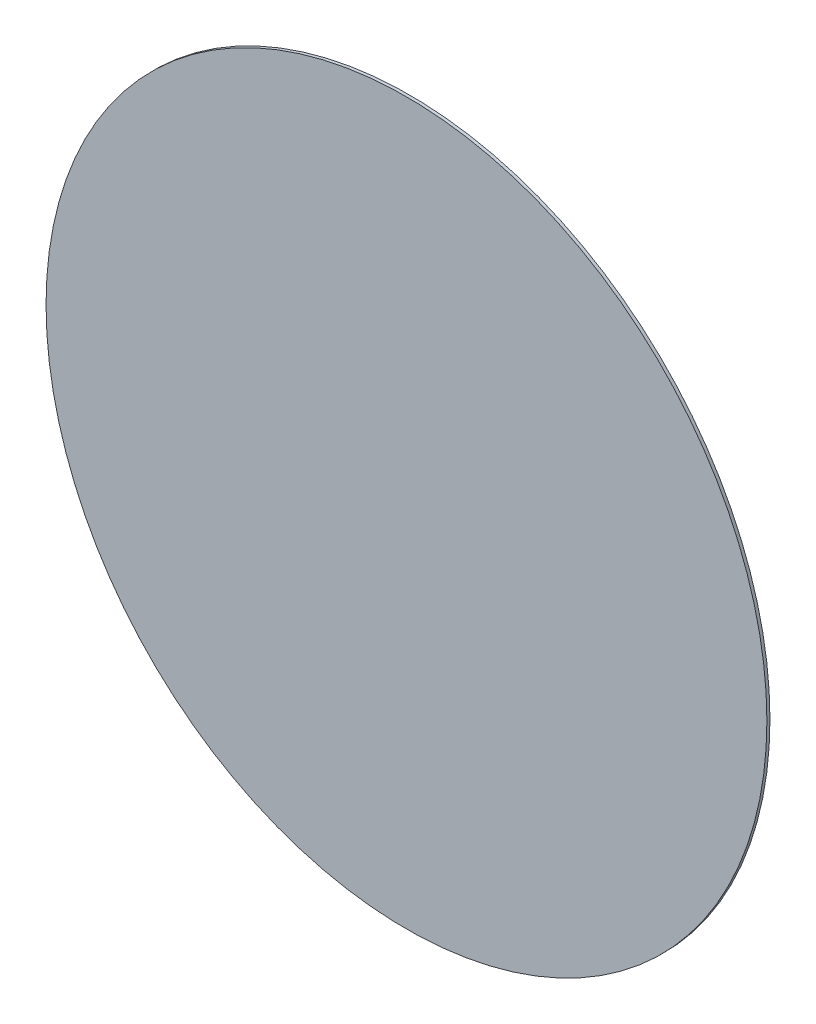
ISO-10303-21;
HEADER;
FILE_DESCRIPTION(('STEP AP214'),'2;1');
FILE_NAME('part.step','',(''),(''),'','','');
FILE_SCHEMA(('AUTOMOTIVE_DESIGN { 1 0 10303 214 1 1 1 1 }'));
ENDSEC;
DATA;
#1=APPLICATION_CONTEXT('core data for automotive mechanical design processes');
#2=APPLICATION_PROTOCOL_DEFINITION('international standard','automotive_design',2000,#1);
#3=PRODUCT_CONTEXT('',#1,'mechanical');
#4=PRODUCT('Part','Part','',(#3));
#5=PRODUCT_RELATED_PRODUCT_CATEGORY('part','',(#4));
#6=PRODUCT_DEFINITION_FORMATION('','',#4);
#7=PRODUCT_DEFINITION_CONTEXT('part definition',#1,'design');
#8=PRODUCT_DEFINITION('design','',#6,#7);
#9=PRODUCT_DEFINITION_SHAPE('','',#8);
#10=(LENGTH_UNIT() NAMED_UNIT(*) SI_UNIT(.MILLI.,.METRE.));
#11=(NAMED_UNIT(*) PLANE_ANGLE_UNIT() SI_UNIT($,.RADIAN.));
#12=(NAMED_UNIT(*) SI_UNIT($,.STERADIAN.) SOLID_ANGLE_UNIT());
#13=UNCERTAINTY_MEASURE_WITH_UNIT(LENGTH_MEASURE(1.E-05),#10,'distance_accuracy_value','');
#14=(GEOMETRIC_REPRESENTATION_CONTEXT(3) GLOBAL_UNCERTAINTY_ASSIGNED_CONTEXT((#13)) GLOBAL_UNIT_ASSIGNED_CONTEXT((#10,
#11,#12)) REPRESENTATION_CONTEXT('',''));
#15=CARTESIAN_POINT('',(0.,0.,0.));
#16=DIRECTION('',(0.,0.,1.));
#17=DIRECTION('',(1.,0.,0.));
#18=AXIS2_PLACEMENT_3D('',#15,#16,#17);
#19=CARTESIAN_POINT('',(0.,0.,0.5));
#20=DIRECTION('',(0.,0.,-1.));
#21=DIRECTION('',(-1.,0.,0.));
#22=AXIS2_PLACEMENT_3D('',#19,#20,#21);
#23=CYLINDRICAL_SURFACE('',#22,59.);
#24=CARTESIAN_POINT('',(0.,0.,0.5));
#25=DIRECTION('',(0.,0.,1.));
#26=DIRECTION('',(1.,0.,0.));
#27=AXIS2_PLACEMENT_3D('',#24,#25,#26);
#28=CIRCLE('',#27,59.);
#29=CARTESIAN_POINT('',(59.,0.,0.5));
#30=VERTEX_POINT('',#29);
#31=EDGE_CURVE('E10',#30,#30,#28,.T.);
#32=ORIENTED_EDGE('',*,*,#31,.F.);
#33=EDGE_LOOP('',(#32));
#34=FACE_BOUND('',#33,.T.);
#35=CARTESIAN_POINT('',(0.,0.,0.));
#36=DIRECTION('',(0.,0.,1.));
#37=DIRECTION('',(1.,0.,0.));
#38=AXIS2_PLACEMENT_3D('',#35,#36,#37);
#39=CIRCLE('',#38,59.);
#40=CARTESIAN_POINT('',(59.,0.,0.));
#41=VERTEX_POINT('',#40);
#42=EDGE_CURVE('E40',#41,#41,#39,.T.);
#43=ORIENTED_EDGE('',*,*,#42,.T.);
#44=EDGE_LOOP('',(#43));
#45=FACE_BOUND('',#44,.T.);
#46=ADVANCED_FACE('F37',(#34,#45),#23,.T.);
#47=CARTESIAN_POINT('',(0.,0.,0.5));
#48=DIRECTION('',(0.,0.,1.));
#49=DIRECTION('',(1.,0.,0.));
#50=AXIS2_PLACEMENT_3D('',#47,#48,#49);
#51=PLANE('',#50);
#52=ORIENTED_EDGE('',*,*,#31,.T.);
#53=EDGE_LOOP('',(#52));
#54=FACE_BOUND('',#53,.T.);
#55=ADVANCED_FACE('F54',(#54),#51,.T.);
#56=CARTESIAN_POINT('',(0.,0.,0.));
#57=DIRECTION('',(0.,0.,1.));
#58=DIRECTION('',(1.,0.,0.));
#59=AXIS2_PLACEMENT_3D('',#56,#57,#58);
#60=PLANE('',#59);
#61=ORIENTED_EDGE('',*,*,#42,.F.);
#62=EDGE_LOOP('',(#61));
#63=FACE_BOUND('',#62,.T.);
#64=ADVANCED_FACE('F52',(#63),#60,.F.);
#65=CLOSED_SHELL('',(#46,#55,#64));
#66=MANIFOLD_SOLID_BREP('B2',#65);
#67=ADVANCED_BREP_SHAPE_REPRESENTATION('',(#18,#66),#14);
#68=SHAPE_DEFINITION_REPRESENTATION(#9,#67);
ENDSEC;
END-ISO-10303-21;
